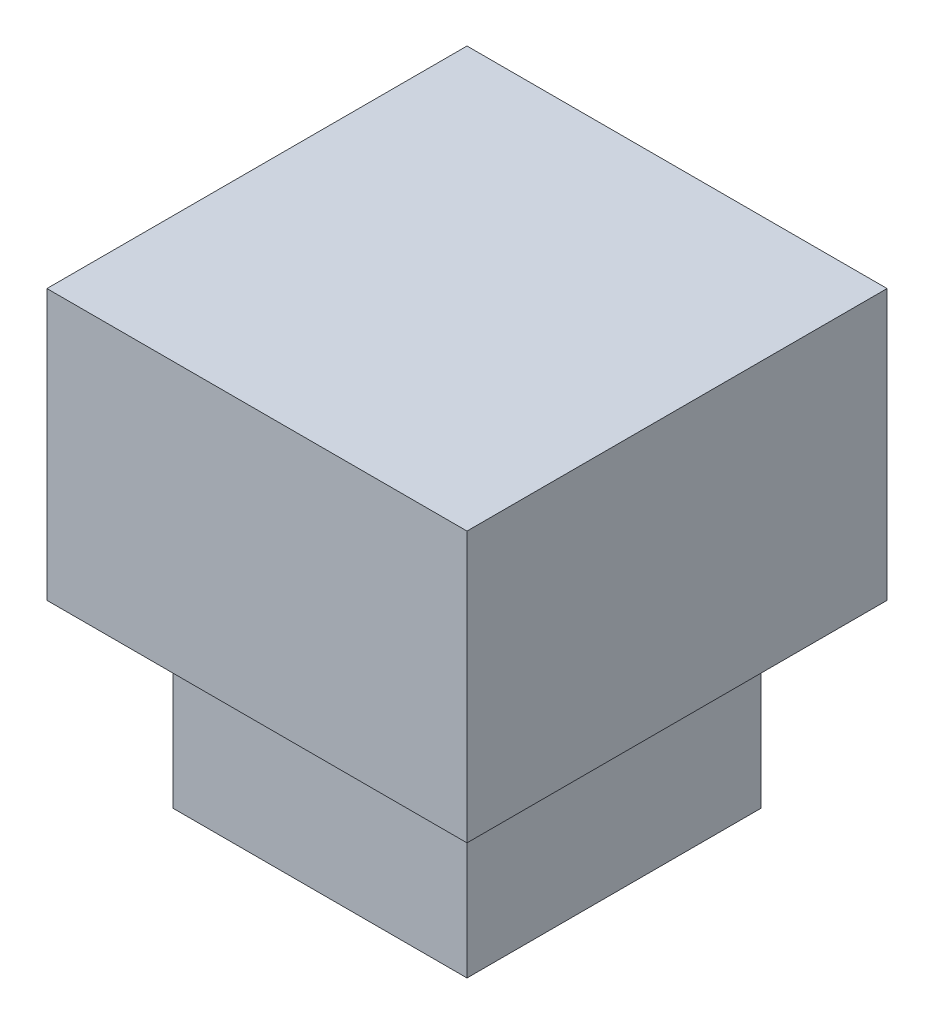
ISO-10303-21;
HEADER;
FILE_DESCRIPTION(('STEP AP214'),'2;1');
FILE_NAME('part.step','',(''),(''),'','','');
FILE_SCHEMA(('AUTOMOTIVE_DESIGN { 1 0 10303 214 1 1 1 1 }'));
ENDSEC;
DATA;
#1=APPLICATION_CONTEXT('core data for automotive mechanical design processes');
#2=APPLICATION_PROTOCOL_DEFINITION('international standard','automotive_design',2000,#1);
#3=PRODUCT_CONTEXT('',#1,'mechanical');
#4=PRODUCT('Part','Part','',(#3));
#5=PRODUCT_RELATED_PRODUCT_CATEGORY('part','',(#4));
#6=PRODUCT_DEFINITION_FORMATION('','',#4);
#7=PRODUCT_DEFINITION_CONTEXT('part definition',#1,'design');
#8=PRODUCT_DEFINITION('design','',#6,#7);
#9=PRODUCT_DEFINITION_SHAPE('','',#8);
#10=(LENGTH_UNIT() NAMED_UNIT(*) SI_UNIT(.MILLI.,.METRE.));
#11=(NAMED_UNIT(*) PLANE_ANGLE_UNIT() SI_UNIT($,.RADIAN.));
#12=(NAMED_UNIT(*) SI_UNIT($,.STERADIAN.) SOLID_ANGLE_UNIT());
#13=UNCERTAINTY_MEASURE_WITH_UNIT(LENGTH_MEASURE(1.E-05),#10,'distance_accuracy_value','');
#14=(GEOMETRIC_REPRESENTATION_CONTEXT(3) GLOBAL_UNCERTAINTY_ASSIGNED_CONTEXT((#13)) GLOBAL_UNIT_ASSIGNED_CONTEXT((#10,
#11,#12)) REPRESENTATION_CONTEXT('',''));
#15=CARTESIAN_POINT('',(0.,0.,0.));
#16=DIRECTION('',(0.,0.,1.));
#17=DIRECTION('',(1.,0.,0.));
#18=AXIS2_PLACEMENT_3D('',#15,#16,#17);
#19=CARTESIAN_POINT('',(2.45,3.,2.45));
#20=DIRECTION('',(-1.,0.,0.));
#21=DIRECTION('',(0.,0.,1.));
#22=AXIS2_PLACEMENT_3D('',#19,#20,#21);
#23=PLANE('',#22);
#24=DIRECTION('',(0.,0.,-1.));
#25=VECTOR('',#24,1.);
#26=CARTESIAN_POINT('',(2.45,0.,2.45));
#27=LINE('',#26,#25);
#28=CARTESIAN_POINT('',(2.45,0.,2.45));
#29=VERTEX_POINT('',#28);
#30=CARTESIAN_POINT('',(2.45,0.,-2.45));
#31=VERTEX_POINT('',#30);
#32=EDGE_CURVE('E131',#29,#31,#27,.T.);
#33=ORIENTED_EDGE('',*,*,#32,.T.);
#34=DIRECTION('',(0.,-1.,0.));
#35=VECTOR('',#34,1.);
#36=CARTESIAN_POINT('',(2.45,3.,-2.45));
#37=LINE('',#36,#35);
#38=CARTESIAN_POINT('',(2.45,3.,-2.45));
#39=VERTEX_POINT('',#38);
#40=EDGE_CURVE('E11',#39,#31,#37,.T.);
#41=ORIENTED_EDGE('',*,*,#40,.F.);
#42=DIRECTION('',(0.,0.,-1.));
#43=VECTOR('',#42,1.);
#44=CARTESIAN_POINT('',(2.45,3.,2.45));
#45=LINE('',#44,#43);
#46=CARTESIAN_POINT('',(2.45,3.,2.45));
#47=VERTEX_POINT('',#46);
#48=EDGE_CURVE('E140',#47,#39,#45,.T.);
#49=ORIENTED_EDGE('',*,*,#48,.F.);
#50=DIRECTION('',(0.,-1.,0.));
#51=VECTOR('',#50,1.);
#52=CARTESIAN_POINT('',(2.45,3.,2.45));
#53=LINE('',#52,#51);
#54=EDGE_CURVE('E149',#47,#29,#53,.T.);
#55=ORIENTED_EDGE('',*,*,#54,.T.);
#56=EDGE_LOOP('',(#33,#41,#49,#55));
#57=FACE_BOUND('',#56,.T.);
#58=ADVANCED_FACE('F33',(#57),#23,.F.);
#59=CARTESIAN_POINT('',(-2.45,3.,-2.45));
#60=DIRECTION('',(0.,0.,1.));
#61=DIRECTION('',(1.,0.,0.));
#62=AXIS2_PLACEMENT_3D('',#59,#60,#61);
#63=PLANE('',#62);
#64=DIRECTION('',(-1.,0.,0.));
#65=VECTOR('',#64,1.);
#66=CARTESIAN_POINT('',(-2.45,0.,-2.45));
#67=LINE('',#66,#65);
#68=CARTESIAN_POINT('',(-2.45,0.,-2.45));
#69=VERTEX_POINT('',#68);
#70=EDGE_CURVE('E134',#31,#69,#67,.T.);
#71=ORIENTED_EDGE('',*,*,#70,.T.);
#72=DIRECTION('',(0.,-1.,0.));
#73=VECTOR('',#72,1.);
#74=CARTESIAN_POINT('',(-2.45,3.,-2.45));
#75=LINE('',#74,#73);
#76=CARTESIAN_POINT('',(-2.45,3.,-2.45));
#77=VERTEX_POINT('',#76);
#78=EDGE_CURVE('E41',#77,#69,#75,.T.);
#79=ORIENTED_EDGE('',*,*,#78,.F.);
#80=DIRECTION('',(-1.,0.,0.));
#81=VECTOR('',#80,1.);
#82=CARTESIAN_POINT('',(-2.45,3.,-2.45));
#83=LINE('',#82,#81);
#84=EDGE_CURVE('E75',#39,#77,#83,.T.);
#85=ORIENTED_EDGE('',*,*,#84,.F.);
#86=ORIENTED_EDGE('',*,*,#40,.T.);
#87=EDGE_LOOP('',(#71,#79,#85,#86));
#88=FACE_BOUND('',#87,.T.);
#89=ADVANCED_FACE('F175',(#88),#63,.F.);
#90=CARTESIAN_POINT('',(-2.45,3.,2.45));
#91=DIRECTION('',(1.,0.,0.));
#92=DIRECTION('',(0.,0.,-1.));
#93=AXIS2_PLACEMENT_3D('',#90,#91,#92);
#94=PLANE('',#93);
#95=DIRECTION('',(0.,0.,1.));
#96=VECTOR('',#95,1.);
#97=CARTESIAN_POINT('',(-2.45,0.,2.45));
#98=LINE('',#97,#96);
#99=CARTESIAN_POINT('',(-2.45,0.,2.45));
#100=VERTEX_POINT('',#99);
#101=EDGE_CURVE('E65',#69,#100,#98,.T.);
#102=ORIENTED_EDGE('',*,*,#101,.T.);
#103=DIRECTION('',(0.,-1.,0.));
#104=VECTOR('',#103,1.);
#105=CARTESIAN_POINT('',(-2.45,3.,2.45));
#106=LINE('',#105,#104);
#107=CARTESIAN_POINT('',(-2.45,3.,2.45));
#108=VERTEX_POINT('',#107);
#109=EDGE_CURVE('E49',#108,#100,#106,.T.);
#110=ORIENTED_EDGE('',*,*,#109,.F.);
#111=DIRECTION('',(0.,0.,1.));
#112=VECTOR('',#111,1.);
#113=CARTESIAN_POINT('',(-2.45,3.,2.45));
#114=LINE('',#113,#112);
#115=EDGE_CURVE('E144',#77,#108,#114,.T.);
#116=ORIENTED_EDGE('',*,*,#115,.F.);
#117=ORIENTED_EDGE('',*,*,#78,.T.);
#118=EDGE_LOOP('',(#102,#110,#116,#117));
#119=FACE_BOUND('',#118,.T.);
#120=ADVANCED_FACE('F155',(#119),#94,.F.);
#121=CARTESIAN_POINT('',(-2.45,3.,2.45));
#122=DIRECTION('',(0.,0.,-1.));
#123=DIRECTION('',(-1.,0.,0.));
#124=AXIS2_PLACEMENT_3D('',#121,#122,#123);
#125=PLANE('',#124);
#126=DIRECTION('',(1.,0.,0.));
#127=VECTOR('',#126,1.);
#128=CARTESIAN_POINT('',(-2.45,0.,2.45));
#129=LINE('',#128,#127);
#130=EDGE_CURVE('E70',#100,#29,#129,.T.);
#131=ORIENTED_EDGE('',*,*,#130,.T.);
#132=ORIENTED_EDGE('',*,*,#54,.F.);
#133=DIRECTION('',(1.,0.,0.));
#134=VECTOR('',#133,1.);
#135=CARTESIAN_POINT('',(-2.45,3.,2.45));
#136=LINE('',#135,#134);
#137=EDGE_CURVE('E147',#108,#47,#136,.T.);
#138=ORIENTED_EDGE('',*,*,#137,.F.);
#139=ORIENTED_EDGE('',*,*,#109,.T.);
#140=EDGE_LOOP('',(#131,#132,#138,#139));
#141=FACE_BOUND('',#140,.T.);
#142=ADVANCED_FACE('F160',(#141),#125,.F.);
#143=CARTESIAN_POINT('',(0.,0.,0.));
#144=DIRECTION('',(0.,-1.,0.));
#145=DIRECTION('',(0.,0.,-1.));
#146=AXIS2_PLACEMENT_3D('',#143,#144,#145);
#147=PLANE('',#146);
#148=ORIENTED_EDGE('',*,*,#32,.F.);
#149=ORIENTED_EDGE('',*,*,#130,.F.);
#150=ORIENTED_EDGE('',*,*,#101,.F.);
#151=ORIENTED_EDGE('',*,*,#70,.F.);
#152=EDGE_LOOP('',(#148,#149,#150,#151));
#153=FACE_BOUND('',#152,.T.);
#154=ADVANCED_FACE('F158',(#153),#147,.T.);
#155=CARTESIAN_POINT('',(0.,3.,0.));
#156=DIRECTION('',(0.,1.,0.));
#157=DIRECTION('',(0.,0.,1.));
#158=AXIS2_PLACEMENT_3D('',#155,#156,#157);
#159=PLANE('',#158);
#160=DIRECTION('',(0.,0.,1.));
#161=VECTOR('',#160,1.);
#162=CARTESIAN_POINT('',(-3.5,3.,3.5));
#163=LINE('',#162,#161);
#164=CARTESIAN_POINT('',(-3.5,3.,-3.5));
#165=VERTEX_POINT('',#164);
#166=CARTESIAN_POINT('',(-3.5,3.,3.5));
#167=VERTEX_POINT('',#166);
#168=EDGE_CURVE('E130',#165,#167,#163,.T.);
#169=ORIENTED_EDGE('',*,*,#168,.F.);
#170=DIRECTION('',(-1.,0.,0.));
#171=VECTOR('',#170,1.);
#172=CARTESIAN_POINT('',(3.5,3.,-3.5));
#173=LINE('',#172,#171);
#174=CARTESIAN_POINT('',(3.5,3.,-3.5));
#175=VERTEX_POINT('',#174);
#176=EDGE_CURVE('E126',#175,#165,#173,.T.);
#177=ORIENTED_EDGE('',*,*,#176,.F.);
#178=DIRECTION('',(0.,0.,-1.));
#179=VECTOR('',#178,1.);
#180=CARTESIAN_POINT('',(3.5,3.,3.5));
#181=LINE('',#180,#179);
#182=CARTESIAN_POINT('',(3.5,3.,3.5));
#183=VERTEX_POINT('',#182);
#184=EDGE_CURVE('E202',#183,#175,#181,.T.);
#185=ORIENTED_EDGE('',*,*,#184,.F.);
#186=DIRECTION('',(1.,0.,0.));
#187=VECTOR('',#186,1.);
#188=CARTESIAN_POINT('',(3.5,3.,3.5));
#189=LINE('',#188,#187);
#190=EDGE_CURVE('E205',#167,#183,#189,.T.);
#191=ORIENTED_EDGE('',*,*,#190,.F.);
#192=EDGE_LOOP('',(#169,#177,#185,#191));
#193=FACE_BOUND('',#192,.T.);
#194=ORIENTED_EDGE('',*,*,#137,.T.);
#195=ORIENTED_EDGE('',*,*,#48,.T.);
#196=ORIENTED_EDGE('',*,*,#84,.T.);
#197=ORIENTED_EDGE('',*,*,#115,.T.);
#198=EDGE_LOOP('',(#194,#195,#196,#197));
#199=FACE_BOUND('',#198,.T.);
#200=ADVANCED_FACE('F162',(#193,#199),#159,.F.);
#201=CARTESIAN_POINT('',(-3.5,7.5,3.5));
#202=DIRECTION('',(1.,0.,0.));
#203=DIRECTION('',(0.,0.,-1.));
#204=AXIS2_PLACEMENT_3D('',#201,#202,#203);
#205=PLANE('',#204);
#206=ORIENTED_EDGE('',*,*,#168,.T.);
#207=DIRECTION('',(0.,-1.,0.));
#208=VECTOR('',#207,1.);
#209=CARTESIAN_POINT('',(-3.5,7.5,3.5));
#210=LINE('',#209,#208);
#211=CARTESIAN_POINT('',(-3.5,7.5,3.5));
#212=VERTEX_POINT('',#211);
#213=EDGE_CURVE('E110',#212,#167,#210,.T.);
#214=ORIENTED_EDGE('',*,*,#213,.F.);
#215=DIRECTION('',(0.,0.,1.));
#216=VECTOR('',#215,1.);
#217=CARTESIAN_POINT('',(-3.5,7.5,3.5));
#218=LINE('',#217,#216);
#219=CARTESIAN_POINT('',(-3.5,7.5,-3.5));
#220=VERTEX_POINT('',#219);
#221=EDGE_CURVE('E117',#220,#212,#218,.T.);
#222=ORIENTED_EDGE('',*,*,#221,.F.);
#223=DIRECTION('',(0.,-1.,0.));
#224=VECTOR('',#223,1.);
#225=CARTESIAN_POINT('',(-3.5,7.5,-3.5));
#226=LINE('',#225,#224);
#227=EDGE_CURVE('E199',#220,#165,#226,.T.);
#228=ORIENTED_EDGE('',*,*,#227,.T.);
#229=EDGE_LOOP('',(#206,#214,#222,#228));
#230=FACE_BOUND('',#229,.T.);
#231=ADVANCED_FACE('F128',(#230),#205,.F.);
#232=CARTESIAN_POINT('',(3.5,7.5,3.5));
#233=DIRECTION('',(0.,0.,-1.));
#234=DIRECTION('',(-1.,0.,0.));
#235=AXIS2_PLACEMENT_3D('',#232,#233,#234);
#236=PLANE('',#235);
#237=ORIENTED_EDGE('',*,*,#190,.T.);
#238=DIRECTION('',(0.,-1.,0.));
#239=VECTOR('',#238,1.);
#240=CARTESIAN_POINT('',(3.5,7.5,3.5));
#241=LINE('',#240,#239);
#242=CARTESIAN_POINT('',(3.5,7.5,3.5));
#243=VERTEX_POINT('',#242);
#244=EDGE_CURVE('E113',#243,#183,#241,.T.);
#245=ORIENTED_EDGE('',*,*,#244,.F.);
#246=DIRECTION('',(1.,0.,0.));
#247=VECTOR('',#246,1.);
#248=CARTESIAN_POINT('',(3.5,7.5,3.5));
#249=LINE('',#248,#247);
#250=EDGE_CURVE('E106',#212,#243,#249,.T.);
#251=ORIENTED_EDGE('',*,*,#250,.F.);
#252=ORIENTED_EDGE('',*,*,#213,.T.);
#253=EDGE_LOOP('',(#237,#245,#251,#252));
#254=FACE_BOUND('',#253,.T.);
#255=ADVANCED_FACE('F108',(#254),#236,.F.);
#256=CARTESIAN_POINT('',(3.5,7.5,3.5));
#257=DIRECTION('',(-1.,0.,0.));
#258=DIRECTION('',(0.,0.,1.));
#259=AXIS2_PLACEMENT_3D('',#256,#257,#258);
#260=PLANE('',#259);
#261=ORIENTED_EDGE('',*,*,#184,.T.);
#262=DIRECTION('',(0.,-1.,0.));
#263=VECTOR('',#262,1.);
#264=CARTESIAN_POINT('',(3.5,7.5,-3.5));
#265=LINE('',#264,#263);
#266=CARTESIAN_POINT('',(3.5,7.5,-3.5));
#267=VERTEX_POINT('',#266);
#268=EDGE_CURVE('E136',#267,#175,#265,.T.);
#269=ORIENTED_EDGE('',*,*,#268,.F.);
#270=DIRECTION('',(0.,0.,-1.));
#271=VECTOR('',#270,1.);
#272=CARTESIAN_POINT('',(3.5,7.5,3.5));
#273=LINE('',#272,#271);
#274=EDGE_CURVE('E116',#243,#267,#273,.T.);
#275=ORIENTED_EDGE('',*,*,#274,.F.);
#276=ORIENTED_EDGE('',*,*,#244,.T.);
#277=EDGE_LOOP('',(#261,#269,#275,#276));
#278=FACE_BOUND('',#277,.T.);
#279=ADVANCED_FACE('F188',(#278),#260,.F.);
#280=CARTESIAN_POINT('',(3.5,7.5,-3.5));
#281=DIRECTION('',(0.,0.,1.));
#282=DIRECTION('',(1.,0.,0.));
#283=AXIS2_PLACEMENT_3D('',#280,#281,#282);
#284=PLANE('',#283);
#285=ORIENTED_EDGE('',*,*,#176,.T.);
#286=ORIENTED_EDGE('',*,*,#227,.F.);
#287=DIRECTION('',(-1.,0.,0.));
#288=VECTOR('',#287,1.);
#289=CARTESIAN_POINT('',(3.5,7.5,-3.5));
#290=LINE('',#289,#288);
#291=EDGE_CURVE('E122',#267,#220,#290,.T.);
#292=ORIENTED_EDGE('',*,*,#291,.F.);
#293=ORIENTED_EDGE('',*,*,#268,.T.);
#294=EDGE_LOOP('',(#285,#286,#292,#293));
#295=FACE_BOUND('',#294,.T.);
#296=ADVANCED_FACE('F190',(#295),#284,.F.);
#297=CARTESIAN_POINT('',(0.,7.5,0.));
#298=DIRECTION('',(0.,1.,0.));
#299=DIRECTION('',(0.,0.,1.));
#300=AXIS2_PLACEMENT_3D('',#297,#298,#299);
#301=PLANE('',#300);
#302=ORIENTED_EDGE('',*,*,#221,.T.);
#303=ORIENTED_EDGE('',*,*,#250,.T.);
#304=ORIENTED_EDGE('',*,*,#274,.T.);
#305=ORIENTED_EDGE('',*,*,#291,.T.);
#306=EDGE_LOOP('',(#302,#303,#304,#305));
#307=FACE_BOUND('',#306,.T.);
#308=ADVANCED_FACE('F120',(#307),#301,.T.);
#309=CLOSED_SHELL('',(#58,#89,#120,#142,#154,#200,#231,#255,#279,#296,#308));
#310=MANIFOLD_SOLID_BREP('B2',#309);
#311=ADVANCED_BREP_SHAPE_REPRESENTATION('',(#18,#310),#14);
#312=SHAPE_DEFINITION_REPRESENTATION(#9,#311);
ENDSEC;
END-ISO-10303-21;
